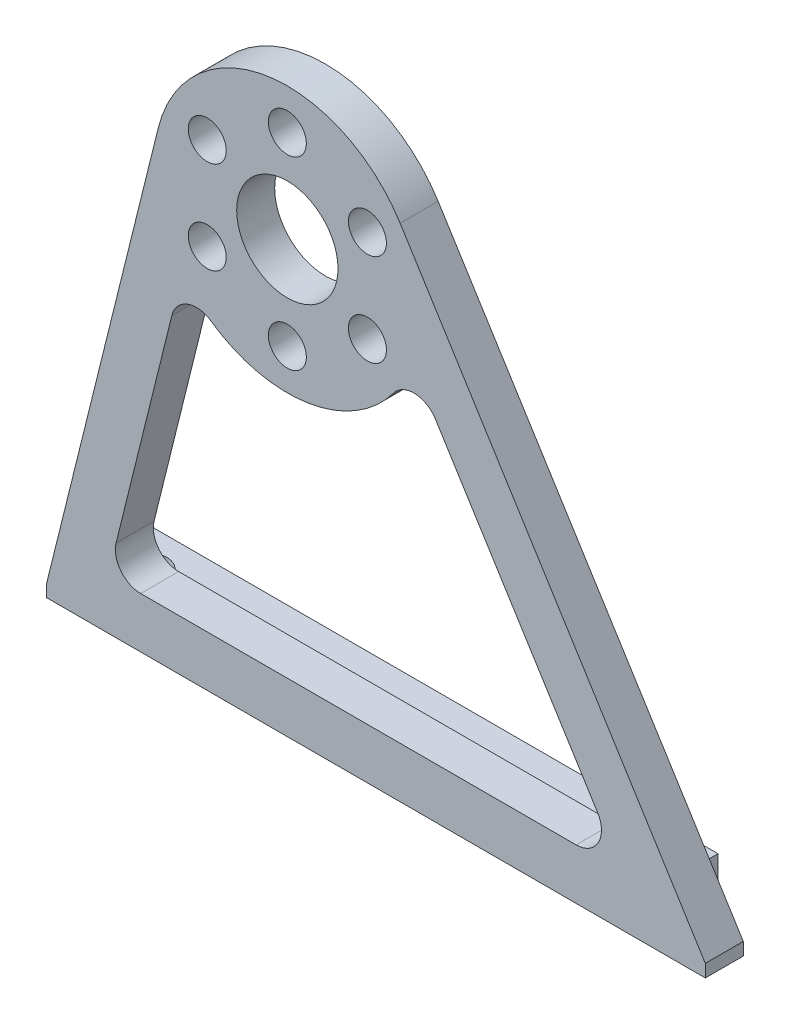
ISO-10303-21;
HEADER;
FILE_DESCRIPTION(('STEP AP214'),'2;1');
FILE_NAME('part.step','',(''),(''),'','','');
FILE_SCHEMA(('AUTOMOTIVE_DESIGN { 1 0 10303 214 1 1 1 1 }'));
ENDSEC;
DATA;
#1=APPLICATION_CONTEXT('core data for automotive mechanical design processes');
#2=APPLICATION_PROTOCOL_DEFINITION('international standard','automotive_design',2000,#1);
#3=PRODUCT_CONTEXT('',#1,'mechanical');
#4=PRODUCT('Part','Part','',(#3));
#5=PRODUCT_RELATED_PRODUCT_CATEGORY('part','',(#4));
#6=PRODUCT_DEFINITION_FORMATION('','',#4);
#7=PRODUCT_DEFINITION_CONTEXT('part definition',#1,'design');
#8=PRODUCT_DEFINITION('design','',#6,#7);
#9=PRODUCT_DEFINITION_SHAPE('','',#8);
#10=(LENGTH_UNIT() NAMED_UNIT(*) SI_UNIT(.MILLI.,.METRE.));
#11=(NAMED_UNIT(*) PLANE_ANGLE_UNIT() SI_UNIT($,.RADIAN.));
#12=(NAMED_UNIT(*) SI_UNIT($,.STERADIAN.) SOLID_ANGLE_UNIT());
#13=UNCERTAINTY_MEASURE_WITH_UNIT(LENGTH_MEASURE(1.E-05),#10,'distance_accuracy_value','');
#14=(GEOMETRIC_REPRESENTATION_CONTEXT(3) GLOBAL_UNCERTAINTY_ASSIGNED_CONTEXT((#13)) GLOBAL_UNIT_ASSIGNED_CONTEXT((#10,
#11,#12)) REPRESENTATION_CONTEXT('',''));
#15=CARTESIAN_POINT('',(0.,0.,0.));
#16=DIRECTION('',(0.,0.,1.));
#17=DIRECTION('',(1.,0.,0.));
#18=AXIS2_PLACEMENT_3D('',#15,#16,#17);
#19=CARTESIAN_POINT('',(0.,0.,6.));
#20=DIRECTION('',(0.,0.,-1.));
#21=DIRECTION('',(-1.,0.,0.));
#22=AXIS2_PLACEMENT_3D('',#19,#20,#21);
#23=CYLINDRICAL_SURFACE('',#22,10.5);
#24=CARTESIAN_POINT('',(0.,0.,3.));
#25=DIRECTION('',(0.,0.,-1.));
#26=DIRECTION('',(-1.,0.,0.));
#27=AXIS2_PLACEMENT_3D('',#24,#25,#26);
#28=CIRCLE('',#27,10.5);
#29=CARTESIAN_POINT('',(-10.1914133471424,2.52687435138502,3.));
#30=VERTEX_POINT('',#29);
#31=CARTESIAN_POINT('',(8.90471895944788,5.56380986853878,3.));
#32=VERTEX_POINT('',#31);
#33=EDGE_CURVE('E48',#30,#32,#28,.T.);
#34=ORIENTED_EDGE('',*,*,#33,.F.);
#35=DIRECTION('',(0.,0.,-1.));
#36=VECTOR('',#35,1.);
#37=CARTESIAN_POINT('',(-10.1914133471424,2.52687435138502,6.));
#38=LINE('',#37,#36);
#39=CARTESIAN_POINT('',(-10.1914133471424,2.52687435138502,6.));
#40=VERTEX_POINT('',#39);
#41=EDGE_CURVE('E316',#40,#30,#38,.T.);
#42=ORIENTED_EDGE('',*,*,#41,.F.);
#43=CARTESIAN_POINT('',(0.,0.,6.));
#44=DIRECTION('',(0.,0.,1.));
#45=DIRECTION('',(1.,0.,0.));
#46=AXIS2_PLACEMENT_3D('',#43,#44,#45);
#47=CIRCLE('',#46,10.5);
#48=CARTESIAN_POINT('',(8.90471895944788,5.56380986853878,6.));
#49=VERTEX_POINT('',#48);
#50=EDGE_CURVE('E282',#49,#40,#47,.T.);
#51=ORIENTED_EDGE('',*,*,#50,.F.);
#52=DIRECTION('',(0.,0.,-1.));
#53=VECTOR('',#52,1.);
#54=CARTESIAN_POINT('',(8.90471895944788,5.56380986853878,6.));
#55=LINE('',#54,#53);
#56=EDGE_CURVE('E296',#49,#32,#55,.T.);
#57=ORIENTED_EDGE('',*,*,#56,.T.);
#58=EDGE_LOOP('',(#34,#42,#51,#57));
#59=FACE_BOUND('',#58,.T.);
#60=ADVANCED_FACE('F34',(#59),#23,.T.);
#61=CARTESIAN_POINT('',(33.,-34.,6.));
#62=DIRECTION('',(-1.,0.,0.));
#63=DIRECTION('',(0.,0.,1.));
#64=AXIS2_PLACEMENT_3D('',#61,#62,#63);
#65=PLANE('',#64);
#66=DIRECTION('',(0.,-1.,0.));
#67=VECTOR('',#66,1.);
#68=CARTESIAN_POINT('',(33.,-34.,3.));
#69=LINE('',#68,#67);
#70=CARTESIAN_POINT('',(33.,-33.,3.));
#71=VERTEX_POINT('',#70);
#72=CARTESIAN_POINT('',(33.,-34.,3.));
#73=VERTEX_POINT('',#72);
#74=EDGE_CURVE('E331',#71,#73,#69,.T.);
#75=ORIENTED_EDGE('',*,*,#74,.F.);
#76=DIRECTION('',(0.,0.,-1.));
#77=VECTOR('',#76,1.);
#78=CARTESIAN_POINT('',(33.,-33.,6.));
#79=LINE('',#78,#77);
#80=CARTESIAN_POINT('',(33.,-33.,6.));
#81=VERTEX_POINT('',#80);
#82=EDGE_CURVE('E304',#81,#71,#79,.T.);
#83=ORIENTED_EDGE('',*,*,#82,.F.);
#84=DIRECTION('',(0.,1.,0.));
#85=VECTOR('',#84,1.);
#86=CARTESIAN_POINT('',(33.,-34.,6.));
#87=LINE('',#86,#85);
#88=CARTESIAN_POINT('',(33.,-34.,6.));
#89=VERTEX_POINT('',#88);
#90=EDGE_CURVE('E292',#89,#81,#87,.T.);
#91=ORIENTED_EDGE('',*,*,#90,.F.);
#92=DIRECTION('',(0.,0.,-1.));
#93=VECTOR('',#92,1.);
#94=CARTESIAN_POINT('',(33.,-34.,6.));
#95=LINE('',#94,#93);
#96=EDGE_CURVE('E307',#89,#73,#95,.T.);
#97=ORIENTED_EDGE('',*,*,#96,.T.);
#98=EDGE_LOOP('',(#75,#83,#91,#97));
#99=FACE_BOUND('',#98,.T.);
#100=ADVANCED_FACE('F406',(#99),#65,.F.);
#101=CARTESIAN_POINT('',(33.,-33.,6.));
#102=DIRECTION('',(-0.848068472328369,-0.529886654146551,0.));
#103=DIRECTION('',(0.529886654146551,-0.848068472328369,0.));
#104=AXIS2_PLACEMENT_3D('',#101,#102,#103);
#105=PLANE('',#104);
#106=DIRECTION('',(0.529886654146551,-0.848068472328369,0.));
#107=VECTOR('',#106,1.);
#108=CARTESIAN_POINT('',(33.,-33.,3.));
#109=LINE('',#108,#107);
#110=EDGE_CURVE('E333',#32,#71,#109,.T.);
#111=ORIENTED_EDGE('',*,*,#110,.F.);
#112=ORIENTED_EDGE('',*,*,#56,.F.);
#113=DIRECTION('',(-0.529886654146551,0.848068472328369,0.));
#114=VECTOR('',#113,1.);
#115=CARTESIAN_POINT('',(33.,-33.,6.));
#116=LINE('',#115,#114);
#117=EDGE_CURVE('E294',#81,#49,#116,.T.);
#118=ORIENTED_EDGE('',*,*,#117,.F.);
#119=ORIENTED_EDGE('',*,*,#82,.T.);
#120=EDGE_LOOP('',(#111,#112,#118,#119));
#121=FACE_BOUND('',#120,.T.);
#122=ADVANCED_FACE('F403',(#121),#105,.F.);
#123=CARTESIAN_POINT('',(0.,0.,6.));
#124=DIRECTION('',(0.,0.,-1.));
#125=DIRECTION('',(-1.,0.,0.));
#126=AXIS2_PLACEMENT_3D('',#123,#124,#125);
#127=CYLINDRICAL_SURFACE('',#126,10.5);
#128=DIRECTION('',(0.,0.,-1.));
#129=VECTOR('',#128,1.);
#130=CARTESIAN_POINT('',(-6.02636205093039,-8.59842778832887,6.));
#131=LINE('',#130,#129);
#132=CARTESIAN_POINT('',(-6.02636205093039,-8.59842778832887,6.));
#133=VERTEX_POINT('',#132);
#134=CARTESIAN_POINT('',(-6.02636205093039,-8.59842778832887,3.));
#135=VERTEX_POINT('',#134);
#136=EDGE_CURVE('E278',#133,#135,#131,.T.);
#137=ORIENTED_EDGE('',*,*,#136,.T.);
#138=CARTESIAN_POINT('',(0.,0.,3.));
#139=DIRECTION('',(0.,0.,-1.));
#140=DIRECTION('',(-1.,0.,0.));
#141=AXIS2_PLACEMENT_3D('',#138,#139,#140);
#142=CIRCLE('',#141,10.5);
#143=CARTESIAN_POINT('',(8.39646805668367,-6.30470650967124,3.));
#144=VERTEX_POINT('',#143);
#145=EDGE_CURVE('E335',#135,#144,#142,.F.);
#146=ORIENTED_EDGE('',*,*,#145,.T.);
#147=DIRECTION('',(0.,0.,-1.));
#148=VECTOR('',#147,1.);
#149=CARTESIAN_POINT('',(8.39646805668367,-6.30470650967124,6.));
#150=LINE('',#149,#148);
#151=CARTESIAN_POINT('',(8.39646805668367,-6.30470650967124,6.));
#152=VERTEX_POINT('',#151);
#153=EDGE_CURVE('E257',#152,#144,#150,.T.);
#154=ORIENTED_EDGE('',*,*,#153,.F.);
#155=CARTESIAN_POINT('',(0.,0.,6.));
#156=DIRECTION('',(0.,0.,-1.));
#157=DIRECTION('',(1.,0.,0.));
#158=AXIS2_PLACEMENT_3D('',#155,#156,#157);
#159=CIRCLE('',#158,10.5);
#160=EDGE_CURVE('E240',#152,#133,#159,.T.);
#161=ORIENTED_EDGE('',*,*,#160,.T.);
#162=EDGE_LOOP('',(#137,#146,#154,#161));
#163=FACE_BOUND('',#162,.T.);
#164=ADVANCED_FACE('F413',(#163),#127,.T.);
#165=CARTESIAN_POINT('',(-7.17424053682189,-10.2362235575344,6.));
#166=DIRECTION('',(0.,0.,-1.));
#167=DIRECTION('',(-1.,0.,0.));
#168=AXIS2_PLACEMENT_3D('',#165,#166,#167);
#169=CYLINDRICAL_SURFACE('',#168,2.);
#170=DIRECTION('',(0.,0.,-1.));
#171=VECTOR('',#170,1.);
#172=CARTESIAN_POINT('',(-9.11546212675378,-9.75491415727056,6.));
#173=LINE('',#172,#171);
#174=CARTESIAN_POINT('',(-9.11546212675378,-9.75491415727056,6.));
#175=VERTEX_POINT('',#174);
#176=CARTESIAN_POINT('',(-9.11546212675378,-9.75491415727056,3.));
#177=VERTEX_POINT('',#176);
#178=EDGE_CURVE('E275',#175,#177,#173,.T.);
#179=ORIENTED_EDGE('',*,*,#178,.T.);
#180=CARTESIAN_POINT('',(-7.17424053682189,-10.2362235575344,3.));
#181=DIRECTION('',(0.,0.,-1.));
#182=DIRECTION('',(-1.,0.,0.));
#183=AXIS2_PLACEMENT_3D('',#180,#181,#182);
#184=CIRCLE('',#183,2.);
#185=EDGE_CURVE('E338',#177,#135,#184,.T.);
#186=ORIENTED_EDGE('',*,*,#185,.T.);
#187=ORIENTED_EDGE('',*,*,#136,.F.);
#188=CARTESIAN_POINT('',(-7.17424053682189,-10.2362235575344,6.));
#189=DIRECTION('',(0.,0.,1.));
#190=DIRECTION('',(1.,0.,0.));
#191=AXIS2_PLACEMENT_3D('',#188,#189,#190);
#192=CIRCLE('',#191,2.);
#193=EDGE_CURVE('E242',#133,#175,#192,.T.);
#194=ORIENTED_EDGE('',*,*,#193,.T.);
#195=EDGE_LOOP('',(#179,#186,#187,#194));
#196=FACE_BOUND('',#195,.T.);
#197=ADVANCED_FACE('F433',(#196),#169,.F.);
#198=CARTESIAN_POINT('',(-9.11546212675378,-9.75491415727056,6.));
#199=DIRECTION('',(0.970610794965944,-0.240654700131907,0.));
#200=DIRECTION('',(0.240654700131907,0.970610794965944,0.));
#201=AXIS2_PLACEMENT_3D('',#198,#199,#200);
#202=PLANE('',#201);
#203=DIRECTION('',(0.,0.,-1.));
#204=VECTOR('',#203,1.);
#205=CARTESIAN_POINT('',(-13.5198395714965,-27.5186905997362,6.));
#206=LINE('',#205,#204);
#207=CARTESIAN_POINT('',(-13.5198395714965,-27.5186905997362,6.));
#208=VERTEX_POINT('',#207);
#209=CARTESIAN_POINT('',(-13.5198395714965,-27.5186905997362,3.));
#210=VERTEX_POINT('',#209);
#211=EDGE_CURVE('E272',#208,#210,#206,.T.);
#212=ORIENTED_EDGE('',*,*,#211,.T.);
#213=DIRECTION('',(0.240654700131907,0.970610794965944,0.));
#214=VECTOR('',#213,1.);
#215=CARTESIAN_POINT('',(-9.11546212675378,-9.75491415727056,3.));
#216=LINE('',#215,#214);
#217=EDGE_CURVE('E341',#210,#177,#216,.T.);
#218=ORIENTED_EDGE('',*,*,#217,.T.);
#219=ORIENTED_EDGE('',*,*,#178,.F.);
#220=DIRECTION('',(-0.240654700131907,-0.970610794965944,0.));
#221=VECTOR('',#220,1.);
#222=CARTESIAN_POINT('',(-9.11546212675378,-9.75491415727056,6.));
#223=LINE('',#222,#221);
#224=EDGE_CURVE('E244',#175,#208,#223,.T.);
#225=ORIENTED_EDGE('',*,*,#224,.T.);
#226=EDGE_LOOP('',(#212,#218,#219,#225));
#227=FACE_BOUND('',#226,.T.);
#228=ADVANCED_FACE('F437',(#227),#202,.T.);
#229=CARTESIAN_POINT('',(-11.5786179815646,-28.,6.));
#230=DIRECTION('',(0.,0.,-1.));
#231=DIRECTION('',(-1.,0.,0.));
#232=AXIS2_PLACEMENT_3D('',#229,#230,#231);
#233=CYLINDRICAL_SURFACE('',#232,2.);
#234=DIRECTION('',(0.,0.,-1.));
#235=VECTOR('',#234,1.);
#236=CARTESIAN_POINT('',(-11.5786179815646,-30.,6.));
#237=LINE('',#236,#235);
#238=CARTESIAN_POINT('',(-11.5786179815646,-30.,6.));
#239=VERTEX_POINT('',#238);
#240=CARTESIAN_POINT('',(-11.5786179815646,-30.,3.));
#241=VERTEX_POINT('',#240);
#242=EDGE_CURVE('E269',#239,#241,#237,.T.);
#243=ORIENTED_EDGE('',*,*,#242,.T.);
#244=CARTESIAN_POINT('',(-11.5786179815646,-28.,3.));
#245=DIRECTION('',(0.,0.,-1.));
#246=DIRECTION('',(-1.,0.,0.));
#247=AXIS2_PLACEMENT_3D('',#244,#245,#246);
#248=CIRCLE('',#247,2.);
#249=EDGE_CURVE('E344',#241,#210,#248,.T.);
#250=ORIENTED_EDGE('',*,*,#249,.T.);
#251=ORIENTED_EDGE('',*,*,#211,.F.);
#252=CARTESIAN_POINT('',(-11.5786179815646,-28.,6.));
#253=DIRECTION('',(0.,0.,1.));
#254=DIRECTION('',(-1.,0.,0.));
#255=AXIS2_PLACEMENT_3D('',#252,#253,#254);
#256=CIRCLE('',#255,2.);
#257=EDGE_CURVE('E246',#208,#239,#256,.T.);
#258=ORIENTED_EDGE('',*,*,#257,.T.);
#259=EDGE_LOOP('',(#243,#250,#251,#258));
#260=FACE_BOUND('',#259,.T.);
#261=ADVANCED_FACE('F441',(#260),#233,.F.);
#262=CARTESIAN_POINT('',(-11.5786179815646,-30.,6.));
#263=DIRECTION('',(0.,1.,0.));
#264=DIRECTION('',(0.,0.,1.));
#265=AXIS2_PLACEMENT_3D('',#262,#263,#264);
#266=PLANE('',#265);
#267=DIRECTION('',(0.,0.,-1.));
#268=VECTOR('',#267,1.);
#269=CARTESIAN_POINT('',(22.8010201381667,-30.,6.));
#270=LINE('',#269,#268);
#271=CARTESIAN_POINT('',(22.8010201381667,-30.,6.));
#272=VERTEX_POINT('',#271);
#273=CARTESIAN_POINT('',(22.8010201381667,-30.,3.));
#274=VERTEX_POINT('',#273);
#275=EDGE_CURVE('E266',#272,#274,#270,.T.);
#276=ORIENTED_EDGE('',*,*,#275,.T.);
#277=DIRECTION('',(-1.,0.,0.));
#278=VECTOR('',#277,1.);
#279=CARTESIAN_POINT('',(-11.5786179815646,-30.,3.));
#280=LINE('',#279,#278);
#281=EDGE_CURVE('E347',#274,#241,#280,.T.);
#282=ORIENTED_EDGE('',*,*,#281,.T.);
#283=ORIENTED_EDGE('',*,*,#242,.F.);
#284=DIRECTION('',(1.,0.,0.));
#285=VECTOR('',#284,1.);
#286=CARTESIAN_POINT('',(-11.5786179815646,-30.,6.));
#287=LINE('',#286,#285);
#288=EDGE_CURVE('E248',#239,#272,#287,.T.);
#289=ORIENTED_EDGE('',*,*,#288,.T.);
#290=EDGE_LOOP('',(#276,#282,#283,#289));
#291=FACE_BOUND('',#290,.T.);
#292=ADVANCED_FACE('F445',(#291),#266,.T.);
#293=CARTESIAN_POINT('',(22.8010201381667,-28.,6.));
#294=DIRECTION('',(0.,0.,-1.));
#295=DIRECTION('',(-1.,0.,0.));
#296=AXIS2_PLACEMENT_3D('',#293,#294,#295);
#297=CYLINDRICAL_SURFACE('',#296,2.);
#298=DIRECTION('',(0.,0.,-1.));
#299=VECTOR('',#298,1.);
#300=CARTESIAN_POINT('',(24.4971570828234,-26.9402266917069,6.));
#301=LINE('',#300,#299);
#302=CARTESIAN_POINT('',(24.4971570828234,-26.9402266917069,6.));
#303=VERTEX_POINT('',#302);
#304=CARTESIAN_POINT('',(24.4971570828234,-26.9402266917069,3.));
#305=VERTEX_POINT('',#304);
#306=EDGE_CURVE('E263',#303,#305,#301,.T.);
#307=ORIENTED_EDGE('',*,*,#306,.T.);
#308=CARTESIAN_POINT('',(22.8010201381667,-28.,3.));
#309=DIRECTION('',(0.,0.,-1.));
#310=DIRECTION('',(-1.,0.,0.));
#311=AXIS2_PLACEMENT_3D('',#308,#309,#310);
#312=CIRCLE('',#311,2.);
#313=EDGE_CURVE('E350',#305,#274,#312,.T.);
#314=ORIENTED_EDGE('',*,*,#313,.T.);
#315=ORIENTED_EDGE('',*,*,#275,.F.);
#316=CARTESIAN_POINT('',(22.8010201381667,-28.,6.));
#317=DIRECTION('',(0.,0.,1.));
#318=DIRECTION('',(1.,0.,0.));
#319=AXIS2_PLACEMENT_3D('',#316,#317,#318);
#320=CIRCLE('',#319,2.);
#321=EDGE_CURVE('E250',#272,#303,#320,.T.);
#322=ORIENTED_EDGE('',*,*,#321,.T.);
#323=EDGE_LOOP('',(#307,#314,#315,#322));
#324=FACE_BOUND('',#323,.T.);
#325=ADVANCED_FACE('F449',(#324),#297,.F.);
#326=CARTESIAN_POINT('',(24.4971570828234,-26.9402266917069,6.));
#327=DIRECTION('',(-0.848068472328369,-0.529886654146551,0.));
#328=DIRECTION('',(0.529886654146551,-0.848068472328369,0.));
#329=AXIS2_PLACEMENT_3D('',#326,#327,#328);
#330=PLANE('',#329);
#331=DIRECTION('',(0.,0.,-1.));
#332=VECTOR('',#331,1.);
#333=CARTESIAN_POINT('',(11.6919322502325,-6.44582967941076,6.));
#334=LINE('',#333,#332);
#335=CARTESIAN_POINT('',(11.6919322502325,-6.44582967941076,6.));
#336=VERTEX_POINT('',#335);
#337=CARTESIAN_POINT('',(11.6919322502325,-6.44582967941076,3.));
#338=VERTEX_POINT('',#337);
#339=EDGE_CURVE('E260',#336,#338,#334,.T.);
#340=ORIENTED_EDGE('',*,*,#339,.T.);
#341=DIRECTION('',(0.529886654146551,-0.848068472328369,0.));
#342=VECTOR('',#341,1.);
#343=CARTESIAN_POINT('',(24.4971570828234,-26.9402266917069,3.));
#344=LINE('',#343,#342);
#345=EDGE_CURVE('E56',#338,#305,#344,.T.);
#346=ORIENTED_EDGE('',*,*,#345,.T.);
#347=ORIENTED_EDGE('',*,*,#306,.F.);
#348=DIRECTION('',(-0.529886654146551,0.848068472328369,0.));
#349=VECTOR('',#348,1.);
#350=CARTESIAN_POINT('',(24.4971570828234,-26.9402266917069,6.));
#351=LINE('',#350,#349);
#352=EDGE_CURVE('E252',#303,#336,#351,.T.);
#353=ORIENTED_EDGE('',*,*,#352,.T.);
#354=EDGE_LOOP('',(#340,#346,#347,#353));
#355=FACE_BOUND('',#354,.T.);
#356=ADVANCED_FACE('F453',(#355),#330,.T.);
#357=CARTESIAN_POINT('',(9.99579530557579,-7.50560298770386,6.));
#358=DIRECTION('',(0.,0.,-1.));
#359=DIRECTION('',(-1.,0.,0.));
#360=AXIS2_PLACEMENT_3D('',#357,#358,#359);
#361=CYLINDRICAL_SURFACE('',#360,2.);
#362=ORIENTED_EDGE('',*,*,#153,.T.);
#363=CARTESIAN_POINT('',(9.99579530557579,-7.50560298770386,3.));
#364=DIRECTION('',(0.,0.,-1.));
#365=DIRECTION('',(-1.,0.,0.));
#366=AXIS2_PLACEMENT_3D('',#363,#364,#365);
#367=CIRCLE('',#366,2.);
#368=EDGE_CURVE('E354',#144,#338,#367,.T.);
#369=ORIENTED_EDGE('',*,*,#368,.T.);
#370=ORIENTED_EDGE('',*,*,#339,.F.);
#371=CARTESIAN_POINT('',(9.99579530557579,-7.50560298770386,6.));
#372=DIRECTION('',(0.,0.,1.));
#373=DIRECTION('',(-1.,0.,0.));
#374=AXIS2_PLACEMENT_3D('',#371,#372,#373);
#375=CIRCLE('',#374,2.);
#376=EDGE_CURVE('E255',#336,#152,#375,.T.);
#377=ORIENTED_EDGE('',*,*,#376,.T.);
#378=EDGE_LOOP('',(#362,#369,#370,#377));
#379=FACE_BOUND('',#378,.T.);
#380=ADVANCED_FACE('F457',(#379),#361,.F.);
#381=CARTESIAN_POINT('',(0.,0.,6.));
#382=DIRECTION('',(0.,0.,-1.));
#383=DIRECTION('',(-1.,0.,0.));
#384=AXIS2_PLACEMENT_3D('',#381,#382,#383);
#385=CYLINDRICAL_SURFACE('',#384,4.);
#386=CARTESIAN_POINT('',(0.,0.,6.));
#387=DIRECTION('',(0.,0.,1.));
#388=DIRECTION('',(1.,0.,0.));
#389=AXIS2_PLACEMENT_3D('',#386,#387,#388);
#390=CIRCLE('',#389,4.);
#391=CARTESIAN_POINT('',(4.,0.,6.));
#392=VERTEX_POINT('',#391);
#393=EDGE_CURVE('E237',#392,#392,#390,.T.);
#394=ORIENTED_EDGE('',*,*,#393,.T.);
#395=EDGE_LOOP('',(#394));
#396=FACE_BOUND('',#395,.T.);
#397=CARTESIAN_POINT('',(0.,0.,3.));
#398=DIRECTION('',(0.,0.,-1.));
#399=DIRECTION('',(-1.,0.,0.));
#400=AXIS2_PLACEMENT_3D('',#397,#398,#399);
#401=CIRCLE('',#400,4.);
#402=CARTESIAN_POINT('',(-4.,0.,3.));
#403=VERTEX_POINT('',#402);
#404=EDGE_CURVE('E356',#403,#403,#401,.T.);
#405=ORIENTED_EDGE('',*,*,#404,.T.);
#406=EDGE_LOOP('',(#405));
#407=FACE_BOUND('',#406,.T.);
#408=ADVANCED_FACE('F461',(#396,#407),#385,.F.);
#409=CARTESIAN_POINT('',(0.,7.3,6.));
#410=DIRECTION('',(0.,0.,-1.));
#411=DIRECTION('',(-1.,0.,0.));
#412=AXIS2_PLACEMENT_3D('',#409,#410,#411);
#413=CYLINDRICAL_SURFACE('',#412,1.5);
#414=CARTESIAN_POINT('',(0.,7.3,6.));
#415=DIRECTION('',(0.,0.,1.));
#416=DIRECTION('',(1.,0.,0.));
#417=AXIS2_PLACEMENT_3D('',#414,#415,#416);
#418=CIRCLE('',#417,1.5);
#419=CARTESIAN_POINT('',(1.5,7.3,6.));
#420=VERTEX_POINT('',#419);
#421=EDGE_CURVE('E234',#420,#420,#418,.T.);
#422=ORIENTED_EDGE('',*,*,#421,.T.);
#423=EDGE_LOOP('',(#422));
#424=FACE_BOUND('',#423,.T.);
#425=CARTESIAN_POINT('',(0.,7.3,3.));
#426=DIRECTION('',(0.,0.,-1.));
#427=DIRECTION('',(-1.,0.,0.));
#428=AXIS2_PLACEMENT_3D('',#425,#426,#427);
#429=CIRCLE('',#428,1.5);
#430=CARTESIAN_POINT('',(-1.5,7.3,3.));
#431=VERTEX_POINT('',#430);
#432=EDGE_CURVE('E359',#431,#431,#429,.T.);
#433=ORIENTED_EDGE('',*,*,#432,.T.);
#434=EDGE_LOOP('',(#433));
#435=FACE_BOUND('',#434,.T.);
#436=ADVANCED_FACE('F465',(#424,#435),#413,.F.);
#437=CARTESIAN_POINT('',(6.32198544762641,3.64999999999999,6.));
#438=DIRECTION('',(0.,0.,-1.));
#439=DIRECTION('',(-1.,0.,0.));
#440=AXIS2_PLACEMENT_3D('',#437,#438,#439);
#441=CYLINDRICAL_SURFACE('',#440,1.5);
#442=CARTESIAN_POINT('',(6.32198544762641,3.64999999999999,6.));
#443=DIRECTION('',(0.,0.,1.));
#444=DIRECTION('',(1.,0.,0.));
#445=AXIS2_PLACEMENT_3D('',#442,#443,#444);
#446=CIRCLE('',#445,1.5);
#447=CARTESIAN_POINT('',(7.82198544762641,3.64999999999999,6.));
#448=VERTEX_POINT('',#447);
#449=EDGE_CURVE('E231',#448,#448,#446,.T.);
#450=ORIENTED_EDGE('',*,*,#449,.T.);
#451=EDGE_LOOP('',(#450));
#452=FACE_BOUND('',#451,.T.);
#453=CARTESIAN_POINT('',(6.32198544762641,3.64999999999999,3.));
#454=DIRECTION('',(0.,0.,-1.));
#455=DIRECTION('',(-1.,0.,0.));
#456=AXIS2_PLACEMENT_3D('',#453,#454,#455);
#457=CIRCLE('',#456,1.5);
#458=CARTESIAN_POINT('',(4.82198544762641,3.64999999999999,3.));
#459=VERTEX_POINT('',#458);
#460=EDGE_CURVE('E362',#459,#459,#457,.T.);
#461=ORIENTED_EDGE('',*,*,#460,.T.);
#462=EDGE_LOOP('',(#461));
#463=FACE_BOUND('',#462,.T.);
#464=ADVANCED_FACE('F469',(#452,#463),#441,.F.);
#465=CARTESIAN_POINT('',(6.32198544762639,-3.65000000000003,6.));
#466=DIRECTION('',(0.,0.,-1.));
#467=DIRECTION('',(-1.,0.,0.));
#468=AXIS2_PLACEMENT_3D('',#465,#466,#467);
#469=CYLINDRICAL_SURFACE('',#468,1.5);
#470=CARTESIAN_POINT('',(6.32198544762639,-3.65000000000003,6.));
#471=DIRECTION('',(0.,0.,1.));
#472=DIRECTION('',(1.,0.,0.));
#473=AXIS2_PLACEMENT_3D('',#470,#471,#472);
#474=CIRCLE('',#473,1.5);
#475=CARTESIAN_POINT('',(7.82198544762639,-3.65000000000003,6.));
#476=VERTEX_POINT('',#475);
#477=EDGE_CURVE('E228',#476,#476,#474,.T.);
#478=ORIENTED_EDGE('',*,*,#477,.T.);
#479=EDGE_LOOP('',(#478));
#480=FACE_BOUND('',#479,.T.);
#481=CARTESIAN_POINT('',(6.32198544762639,-3.65000000000003,3.));
#482=DIRECTION('',(0.,0.,-1.));
#483=DIRECTION('',(-1.,0.,0.));
#484=AXIS2_PLACEMENT_3D('',#481,#482,#483);
#485=CIRCLE('',#484,1.5);
#486=CARTESIAN_POINT('',(4.82198544762639,-3.65000000000003,3.));
#487=VERTEX_POINT('',#486);
#488=EDGE_CURVE('E365',#487,#487,#485,.T.);
#489=ORIENTED_EDGE('',*,*,#488,.T.);
#490=EDGE_LOOP('',(#489));
#491=FACE_BOUND('',#490,.T.);
#492=ADVANCED_FACE('F473',(#480,#491),#469,.F.);
#493=CARTESIAN_POINT('',(6.20647540774354E-13,-7.3,6.));
#494=DIRECTION('',(0.,0.,-1.));
#495=DIRECTION('',(-1.,0.,0.));
#496=AXIS2_PLACEMENT_3D('',#493,#494,#495);
#497=CYLINDRICAL_SURFACE('',#496,1.50000000000064);
#498=CARTESIAN_POINT('',(6.20647540774354E-13,-7.3,6.));
#499=DIRECTION('',(0.,0.,1.));
#500=DIRECTION('',(1.,0.,0.));
#501=AXIS2_PLACEMENT_3D('',#498,#499,#500);
#502=CIRCLE('',#501,1.50000000000064);
#503=CARTESIAN_POINT('',(1.50000000000126,-7.3,6.));
#504=VERTEX_POINT('',#503);
#505=EDGE_CURVE('E225',#504,#504,#502,.T.);
#506=ORIENTED_EDGE('',*,*,#505,.T.);
#507=EDGE_LOOP('',(#506));
#508=FACE_BOUND('',#507,.T.);
#509=CARTESIAN_POINT('',(6.20647540774354E-13,-7.3,3.));
#510=DIRECTION('',(0.,0.,-1.));
#511=DIRECTION('',(-1.,0.,0.));
#512=AXIS2_PLACEMENT_3D('',#509,#510,#511);
#513=CIRCLE('',#512,1.50000000000064);
#514=CARTESIAN_POINT('',(-1.50000000000002,-7.3,3.));
#515=VERTEX_POINT('',#514);
#516=EDGE_CURVE('E368',#515,#515,#513,.T.);
#517=ORIENTED_EDGE('',*,*,#516,.T.);
#518=EDGE_LOOP('',(#517));
#519=FACE_BOUND('',#518,.T.);
#520=ADVANCED_FACE('F477',(#508,#519),#497,.F.);
#521=CARTESIAN_POINT('',(-6.32198544762594,-3.65000000000027,6.));
#522=DIRECTION('',(0.,0.,-1.));
#523=DIRECTION('',(-1.,0.,0.));
#524=AXIS2_PLACEMENT_3D('',#521,#522,#523);
#525=CYLINDRICAL_SURFACE('',#524,1.50000000000059);
#526=CARTESIAN_POINT('',(-6.32198544762594,-3.65000000000027,6.));
#527=DIRECTION('',(0.,0.,1.));
#528=DIRECTION('',(1.,0.,0.));
#529=AXIS2_PLACEMENT_3D('',#526,#527,#528);
#530=CIRCLE('',#529,1.50000000000059);
#531=CARTESIAN_POINT('',(-4.82198544762534,-3.65000000000027,6.));
#532=VERTEX_POINT('',#531);
#533=EDGE_CURVE('E214',#532,#532,#530,.T.);
#534=ORIENTED_EDGE('',*,*,#533,.T.);
#535=EDGE_LOOP('',(#534));
#536=FACE_BOUND('',#535,.T.);
#537=CARTESIAN_POINT('',(-6.32198544762594,-3.65000000000027,3.));
#538=DIRECTION('',(0.,0.,-1.));
#539=DIRECTION('',(-1.,0.,0.));
#540=AXIS2_PLACEMENT_3D('',#537,#538,#539);
#541=CIRCLE('',#540,1.50000000000059);
#542=CARTESIAN_POINT('',(-7.82198544762653,-3.65000000000027,3.));
#543=VERTEX_POINT('',#542);
#544=EDGE_CURVE('E371',#543,#543,#541,.T.);
#545=ORIENTED_EDGE('',*,*,#544,.T.);
#546=EDGE_LOOP('',(#545));
#547=FACE_BOUND('',#546,.T.);
#548=ADVANCED_FACE('F481',(#536,#547),#525,.F.);
#549=CARTESIAN_POINT('',(-6.32198544762636,3.65000000000007,6.));
#550=DIRECTION('',(0.,0.,-1.));
#551=DIRECTION('',(-1.,0.,0.));
#552=AXIS2_PLACEMENT_3D('',#549,#550,#551);
#553=CYLINDRICAL_SURFACE('',#552,1.5);
#554=CARTESIAN_POINT('',(-6.32198544762636,3.65000000000007,6.));
#555=DIRECTION('',(0.,0.,1.));
#556=DIRECTION('',(1.,0.,0.));
#557=AXIS2_PLACEMENT_3D('',#554,#555,#556);
#558=CIRCLE('',#557,1.5);
#559=CARTESIAN_POINT('',(-4.82198544762636,3.65000000000007,6.));
#560=VERTEX_POINT('',#559);
#561=EDGE_CURVE('E210',#560,#560,#558,.T.);
#562=ORIENTED_EDGE('',*,*,#561,.T.);
#563=EDGE_LOOP('',(#562));
#564=FACE_BOUND('',#563,.T.);
#565=CARTESIAN_POINT('',(-6.32198544762636,3.65000000000007,3.));
#566=DIRECTION('',(0.,0.,-1.));
#567=DIRECTION('',(-1.,0.,0.));
#568=AXIS2_PLACEMENT_3D('',#565,#566,#567);
#569=CIRCLE('',#568,1.5);
#570=CARTESIAN_POINT('',(-7.82198544762636,3.65000000000007,3.));
#571=VERTEX_POINT('',#570);
#572=EDGE_CURVE('E182',#571,#571,#569,.T.);
#573=ORIENTED_EDGE('',*,*,#572,.T.);
#574=EDGE_LOOP('',(#573));
#575=FACE_BOUND('',#574,.T.);
#576=ADVANCED_FACE('F485',(#564,#575),#553,.F.);
#577=CARTESIAN_POINT('',(-14.,-31.,2.99999999999999));
#578=DIRECTION('',(0.,-1.,0.));
#579=DIRECTION('',(0.,0.,-1.));
#580=AXIS2_PLACEMENT_3D('',#577,#578,#579);
#581=PLANE('',#580);
#582=CARTESIAN_POINT('',(-14.,-31.,2.99999999999999));
#583=DIRECTION('',(0.,-1.,0.));
#584=DIRECTION('',(0.,0.,-1.));
#585=AXIS2_PLACEMENT_3D('',#582,#583,#584);
#586=CIRCLE('',#585,1.5);
#587=CARTESIAN_POINT('',(-12.5,-31.,3.));
#588=VERTEX_POINT('',#587);
#589=CARTESIAN_POINT('',(-15.5,-31.,3.));
#590=VERTEX_POINT('',#589);
#591=EDGE_CURVE('E205',#588,#590,#586,.T.);
#592=ORIENTED_EDGE('',*,*,#591,.T.);
#593=DIRECTION('',(-1.,0.,0.));
#594=VECTOR('',#593,1.);
#595=CARTESIAN_POINT('',(-22.8481753674721,-31.,3.));
#596=LINE('',#595,#594);
#597=EDGE_CURVE('E190',#588,#590,#596,.T.);
#598=ORIENTED_EDGE('',*,*,#597,.F.);
#599=EDGE_LOOP('',(#592,#598));
#600=FACE_BOUND('',#599,.T.);
#601=ADVANCED_FACE('F209',(#600),#581,.T.);
#602=CARTESIAN_POINT('',(23.,-31.,3.00000000000001));
#603=DIRECTION('',(0.,-1.,0.));
#604=DIRECTION('',(0.,0.,-1.));
#605=AXIS2_PLACEMENT_3D('',#602,#603,#604);
#606=PLANE('',#605);
#607=CARTESIAN_POINT('',(23.,-31.,3.00000000000001));
#608=DIRECTION('',(0.,-1.,0.));
#609=DIRECTION('',(0.,0.,-1.));
#610=AXIS2_PLACEMENT_3D('',#607,#608,#609);
#611=CIRCLE('',#610,1.5);
#612=CARTESIAN_POINT('',(24.5,-31.,3.));
#613=VERTEX_POINT('',#612);
#614=CARTESIAN_POINT('',(21.5,-31.,3.));
#615=VERTEX_POINT('',#614);
#616=EDGE_CURVE('E217',#613,#615,#611,.T.);
#617=ORIENTED_EDGE('',*,*,#616,.T.);
#618=DIRECTION('',(1.,0.,0.));
#619=VECTOR('',#618,1.);
#620=CARTESIAN_POINT('',(23.,-31.,3.));
#621=LINE('',#620,#619);
#622=EDGE_CURVE('E41',#615,#613,#621,.T.);
#623=ORIENTED_EDGE('',*,*,#622,.T.);
#624=EDGE_LOOP('',(#617,#623));
#625=FACE_BOUND('',#624,.T.);
#626=ADVANCED_FACE('F321',(#625),#606,.T.);
#627=CARTESIAN_POINT('',(0.,0.,6.));
#628=DIRECTION('',(0.,0.,1.));
#629=DIRECTION('',(1.,0.,0.));
#630=AXIS2_PLACEMENT_3D('',#627,#628,#629);
#631=PLANE('',#630);
#632=ORIENTED_EDGE('',*,*,#533,.F.);
#633=EDGE_LOOP('',(#632));
#634=FACE_BOUND('',#633,.T.);
#635=ORIENTED_EDGE('',*,*,#477,.F.);
#636=EDGE_LOOP('',(#635));
#637=FACE_BOUND('',#636,.T.);
#638=ORIENTED_EDGE('',*,*,#421,.F.);
#639=EDGE_LOOP('',(#638));
#640=FACE_BOUND('',#639,.T.);
#641=ORIENTED_EDGE('',*,*,#193,.F.);
#642=ORIENTED_EDGE('',*,*,#160,.F.);
#643=ORIENTED_EDGE('',*,*,#376,.F.);
#644=ORIENTED_EDGE('',*,*,#352,.F.);
#645=ORIENTED_EDGE('',*,*,#321,.F.);
#646=ORIENTED_EDGE('',*,*,#288,.F.);
#647=ORIENTED_EDGE('',*,*,#257,.F.);
#648=ORIENTED_EDGE('',*,*,#224,.F.);
#649=EDGE_LOOP('',(#641,#642,#643,#644,#645,#646,#647,#648));
#650=FACE_BOUND('',#649,.T.);
#651=ORIENTED_EDGE('',*,*,#50,.T.);
#652=DIRECTION('',(-0.240654700131907,-0.970610794965944,0.));
#653=VECTOR('',#652,1.);
#654=CARTESIAN_POINT('',(-10.1914133471424,2.52687435138502,6.));
#655=LINE('',#654,#653);
#656=CARTESIAN_POINT('',(-19.,-33.,6.));
#657=VERTEX_POINT('',#656);
#658=EDGE_CURVE('E285',#40,#657,#655,.T.);
#659=ORIENTED_EDGE('',*,*,#658,.T.);
#660=DIRECTION('',(0.,-1.,0.));
#661=VECTOR('',#660,1.);
#662=CARTESIAN_POINT('',(-19.,-33.,6.));
#663=LINE('',#662,#661);
#664=CARTESIAN_POINT('',(-19.,-34.,6.));
#665=VERTEX_POINT('',#664);
#666=EDGE_CURVE('E288',#657,#665,#663,.T.);
#667=ORIENTED_EDGE('',*,*,#666,.T.);
#668=DIRECTION('',(1.,0.,0.));
#669=VECTOR('',#668,1.);
#670=CARTESIAN_POINT('',(-19.,-34.,6.));
#671=LINE('',#670,#669);
#672=EDGE_CURVE('E290',#665,#89,#671,.T.);
#673=ORIENTED_EDGE('',*,*,#672,.T.);
#674=ORIENTED_EDGE('',*,*,#90,.T.);
#675=ORIENTED_EDGE('',*,*,#117,.T.);
#676=EDGE_LOOP('',(#651,#659,#667,#673,#674,#675));
#677=FACE_BOUND('',#676,.T.);
#678=ORIENTED_EDGE('',*,*,#393,.F.);
#679=EDGE_LOOP('',(#678));
#680=FACE_BOUND('',#679,.T.);
#681=ORIENTED_EDGE('',*,*,#449,.F.);
#682=EDGE_LOOP('',(#681));
#683=FACE_BOUND('',#682,.T.);
#684=ORIENTED_EDGE('',*,*,#505,.F.);
#685=EDGE_LOOP('',(#684));
#686=FACE_BOUND('',#685,.T.);
#687=ORIENTED_EDGE('',*,*,#561,.F.);
#688=EDGE_LOOP('',(#687));
#689=FACE_BOUND('',#688,.T.);
#690=ADVANCED_FACE('F394',(#634,#637,#640,#650,#677,#680,#683,#686,#689),#631,.T.);
#691=CARTESIAN_POINT('',(0.,0.,0.));
#692=DIRECTION('',(0.,0.,1.));
#693=DIRECTION('',(1.,0.,0.));
#694=AXIS2_PLACEMENT_3D('',#691,#692,#693);
#695=PLANE('',#694);
#696=DIRECTION('',(-0.240654700131907,-0.970610794965944,0.));
#697=VECTOR('',#696,1.);
#698=CARTESIAN_POINT('',(-10.1914133471424,2.52687435138502,0.));
#699=LINE('',#698,#697);
#700=CARTESIAN_POINT('',(-18.5041169923515,-31.,0.));
#701=VERTEX_POINT('',#700);
#702=CARTESIAN_POINT('',(-19.,-33.,0.));
#703=VERTEX_POINT('',#702);
#704=EDGE_CURVE('E281',#701,#703,#699,.T.);
#705=ORIENTED_EDGE('',*,*,#704,.F.);
#706=DIRECTION('',(-1.,0.,0.));
#707=VECTOR('',#706,1.);
#708=CARTESIAN_POINT('',(-22.8481753674721,-31.,0.));
#709=LINE('',#708,#707);
#710=CARTESIAN_POINT('',(28.,-31.,0.));
#711=VERTEX_POINT('',#710);
#712=EDGE_CURVE('E173',#711,#701,#709,.T.);
#713=ORIENTED_EDGE('',*,*,#712,.F.);
#714=DIRECTION('',(0.,1.,0.));
#715=VECTOR('',#714,1.);
#716=CARTESIAN_POINT('',(28.,-31.,0.));
#717=LINE('',#716,#715);
#718=CARTESIAN_POINT('',(28.,-34.,0.));
#719=VERTEX_POINT('',#718);
#720=EDGE_CURVE('E179',#719,#711,#717,.T.);
#721=ORIENTED_EDGE('',*,*,#720,.F.);
#722=DIRECTION('',(1.,0.,0.));
#723=VECTOR('',#722,1.);
#724=CARTESIAN_POINT('',(-19.,-34.,0.));
#725=LINE('',#724,#723);
#726=CARTESIAN_POINT('',(-19.,-34.,0.));
#727=VERTEX_POINT('',#726);
#728=EDGE_CURVE('E286',#727,#719,#725,.T.);
#729=ORIENTED_EDGE('',*,*,#728,.F.);
#730=DIRECTION('',(0.,-1.,0.));
#731=VECTOR('',#730,1.);
#732=CARTESIAN_POINT('',(-19.,-33.,0.));
#733=LINE('',#732,#731);
#734=EDGE_CURVE('E298',#703,#727,#733,.T.);
#735=ORIENTED_EDGE('',*,*,#734,.F.);
#736=EDGE_LOOP('',(#705,#713,#721,#729,#735));
#737=FACE_BOUND('',#736,.T.);
#738=ADVANCED_FACE('F382',(#737),#695,.F.);
#739=CARTESIAN_POINT('',(-10.1914133471424,2.52687435138502,6.));
#740=DIRECTION('',(0.970610794965944,-0.240654700131907,0.));
#741=DIRECTION('',(0.240654700131907,0.970610794965944,0.));
#742=AXIS2_PLACEMENT_3D('',#739,#740,#741);
#743=PLANE('',#742);
#744=DIRECTION('',(0.240654700131907,0.970610794965944,0.));
#745=VECTOR('',#744,1.);
#746=CARTESIAN_POINT('',(-10.1914133471424,2.52687435138502,3.));
#747=LINE('',#746,#745);
#748=CARTESIAN_POINT('',(-18.5041169923515,-31.,3.));
#749=VERTEX_POINT('',#748);
#750=EDGE_CURVE('E207',#749,#30,#747,.T.);
#751=ORIENTED_EDGE('',*,*,#750,.F.);
#752=DIRECTION('',(0.,0.,-1.));
#753=VECTOR('',#752,1.);
#754=CARTESIAN_POINT('',(-18.5041169923515,-31.,6.));
#755=LINE('',#754,#753);
#756=EDGE_CURVE('E206',#749,#701,#755,.T.);
#757=ORIENTED_EDGE('',*,*,#756,.T.);
#758=ORIENTED_EDGE('',*,*,#704,.T.);
#759=DIRECTION('',(0.,0.,-1.));
#760=VECTOR('',#759,1.);
#761=CARTESIAN_POINT('',(-19.,-33.,6.));
#762=LINE('',#761,#760);
#763=EDGE_CURVE('E313',#657,#703,#762,.T.);
#764=ORIENTED_EDGE('',*,*,#763,.F.);
#765=ORIENTED_EDGE('',*,*,#658,.F.);
#766=ORIENTED_EDGE('',*,*,#41,.T.);
#767=EDGE_LOOP('',(#751,#757,#758,#764,#765,#766));
#768=FACE_BOUND('',#767,.T.);
#769=ADVANCED_FACE('F379',(#768),#743,.F.);
#770=CARTESIAN_POINT('',(-19.,-33.,6.));
#771=DIRECTION('',(1.,0.,0.));
#772=DIRECTION('',(0.,0.,-1.));
#773=AXIS2_PLACEMENT_3D('',#770,#771,#772);
#774=PLANE('',#773);
#775=ORIENTED_EDGE('',*,*,#734,.T.);
#776=DIRECTION('',(0.,0.,-1.));
#777=VECTOR('',#776,1.);
#778=CARTESIAN_POINT('',(-19.,-34.,6.));
#779=LINE('',#778,#777);
#780=EDGE_CURVE('E310',#665,#727,#779,.T.);
#781=ORIENTED_EDGE('',*,*,#780,.F.);
#782=ORIENTED_EDGE('',*,*,#666,.F.);
#783=ORIENTED_EDGE('',*,*,#763,.T.);
#784=EDGE_LOOP('',(#775,#781,#782,#783));
#785=FACE_BOUND('',#784,.T.);
#786=ADVANCED_FACE('F386',(#785),#774,.F.);
#787=CARTESIAN_POINT('',(-19.,-34.,6.));
#788=DIRECTION('',(0.,1.,0.));
#789=DIRECTION('',(0.,0.,1.));
#790=AXIS2_PLACEMENT_3D('',#787,#788,#789);
#791=PLANE('',#790);
#792=CARTESIAN_POINT('',(23.,-34.,3.00000000000001));
#793=DIRECTION('',(0.,-1.,0.));
#794=DIRECTION('',(0.,0.,-1.));
#795=AXIS2_PLACEMENT_3D('',#792,#793,#794);
#796=CIRCLE('',#795,1.5);
#797=CARTESIAN_POINT('',(23.,-34.,1.5));
#798=VERTEX_POINT('',#797);
#799=EDGE_CURVE('E220',#798,#798,#796,.T.);
#800=ORIENTED_EDGE('',*,*,#799,.F.);
#801=EDGE_LOOP('',(#800));
#802=FACE_BOUND('',#801,.T.);
#803=CARTESIAN_POINT('',(-14.,-34.,2.99999999999999));
#804=DIRECTION('',(0.,-1.,0.));
#805=DIRECTION('',(0.,0.,-1.));
#806=AXIS2_PLACEMENT_3D('',#803,#804,#805);
#807=CIRCLE('',#806,1.5);
#808=CARTESIAN_POINT('',(-14.,-34.,1.49999999999999));
#809=VERTEX_POINT('',#808);
#810=EDGE_CURVE('E211',#809,#809,#807,.T.);
#811=ORIENTED_EDGE('',*,*,#810,.F.);
#812=EDGE_LOOP('',(#811));
#813=FACE_BOUND('',#812,.T.);
#814=ORIENTED_EDGE('',*,*,#728,.T.);
#815=DIRECTION('',(0.,0.,1.));
#816=VECTOR('',#815,1.);
#817=CARTESIAN_POINT('',(28.,-34.,6.));
#818=LINE('',#817,#816);
#819=CARTESIAN_POINT('',(28.,-34.,3.));
#820=VERTEX_POINT('',#819);
#821=EDGE_CURVE('E11',#719,#820,#818,.T.);
#822=ORIENTED_EDGE('',*,*,#821,.T.);
#823=DIRECTION('',(-1.,0.,0.));
#824=VECTOR('',#823,1.);
#825=CARTESIAN_POINT('',(-19.,-34.,3.));
#826=LINE('',#825,#824);
#827=EDGE_CURVE('E170',#73,#820,#826,.T.);
#828=ORIENTED_EDGE('',*,*,#827,.F.);
#829=ORIENTED_EDGE('',*,*,#96,.F.);
#830=ORIENTED_EDGE('',*,*,#672,.F.);
#831=ORIENTED_EDGE('',*,*,#780,.T.);
#832=EDGE_LOOP('',(#814,#822,#828,#829,#830,#831));
#833=FACE_BOUND('',#832,.T.);
#834=ADVANCED_FACE('F390',(#802,#813,#833),#791,.F.);
#835=CARTESIAN_POINT('',(-14.,-31.,2.99999999999999));
#836=DIRECTION('',(0.,-1.,0.));
#837=DIRECTION('',(0.,0.,-1.));
#838=AXIS2_PLACEMENT_3D('',#835,#836,#837);
#839=CYLINDRICAL_SURFACE('',#838,1.5);
#840=ORIENTED_EDGE('',*,*,#591,.F.);
#841=CARTESIAN_POINT('',(-14.,-31.,2.99999999999999));
#842=DIRECTION('',(0.,-1.,0.));
#843=DIRECTION('',(1.,0.,0.));
#844=AXIS2_PLACEMENT_3D('',#841,#842,#843);
#845=CIRCLE('',#844,1.5);
#846=EDGE_CURVE('E202',#588,#590,#845,.F.);
#847=ORIENTED_EDGE('',*,*,#846,.T.);
#848=EDGE_LOOP('',(#840,#847));
#849=FACE_BOUND('',#848,.T.);
#850=ORIENTED_EDGE('',*,*,#810,.T.);
#851=EDGE_LOOP('',(#850));
#852=FACE_BOUND('',#851,.T.);
#853=ADVANCED_FACE('F203',(#849,#852),#839,.F.);
#854=CARTESIAN_POINT('',(23.,-31.,3.00000000000001));
#855=DIRECTION('',(0.,-1.,0.));
#856=DIRECTION('',(0.,0.,-1.));
#857=AXIS2_PLACEMENT_3D('',#854,#855,#856);
#858=CYLINDRICAL_SURFACE('',#857,1.5);
#859=ORIENTED_EDGE('',*,*,#616,.F.);
#860=EDGE_CURVE('E186',#615,#613,#611,.T.);
#861=ORIENTED_EDGE('',*,*,#860,.F.);
#862=EDGE_LOOP('',(#859,#861));
#863=FACE_BOUND('',#862,.T.);
#864=ORIENTED_EDGE('',*,*,#799,.T.);
#865=EDGE_LOOP('',(#864));
#866=FACE_BOUND('',#865,.T.);
#867=ADVANCED_FACE('F323',(#863,#866),#858,.F.);
#868=CARTESIAN_POINT('',(28.,-31.,3.));
#869=DIRECTION('',(-1.,0.,0.));
#870=DIRECTION('',(0.,0.,1.));
#871=AXIS2_PLACEMENT_3D('',#868,#869,#870);
#872=PLANE('',#871);
#873=ORIENTED_EDGE('',*,*,#720,.T.);
#874=DIRECTION('',(0.,0.,-1.));
#875=VECTOR('',#874,1.);
#876=CARTESIAN_POINT('',(28.,-31.,3.));
#877=LINE('',#876,#875);
#878=CARTESIAN_POINT('',(28.,-31.,3.));
#879=VERTEX_POINT('',#878);
#880=EDGE_CURVE('E176',#879,#711,#877,.T.);
#881=ORIENTED_EDGE('',*,*,#880,.F.);
#882=DIRECTION('',(0.,1.,0.));
#883=VECTOR('',#882,1.);
#884=CARTESIAN_POINT('',(28.,-31.,3.));
#885=LINE('',#884,#883);
#886=EDGE_CURVE('E162',#820,#879,#885,.T.);
#887=ORIENTED_EDGE('',*,*,#886,.F.);
#888=ORIENTED_EDGE('',*,*,#821,.F.);
#889=EDGE_LOOP('',(#873,#881,#887,#888));
#890=FACE_BOUND('',#889,.T.);
#891=ADVANCED_FACE('F177',(#890),#872,.F.);
#892=CARTESIAN_POINT('',(-22.8481753674721,-31.,3.));
#893=DIRECTION('',(0.,-1.,0.));
#894=DIRECTION('',(1.,0.,0.));
#895=AXIS2_PLACEMENT_3D('',#892,#893,#894);
#896=PLANE('',#895);
#897=EDGE_CURVE('E172',#590,#749,#596,.T.);
#898=ORIENTED_EDGE('',*,*,#897,.F.);
#899=ORIENTED_EDGE('',*,*,#846,.F.);
#900=EDGE_CURVE('E188',#615,#588,#596,.T.);
#901=ORIENTED_EDGE('',*,*,#900,.F.);
#902=ORIENTED_EDGE('',*,*,#860,.T.);
#903=EDGE_CURVE('E167',#879,#613,#596,.T.);
#904=ORIENTED_EDGE('',*,*,#903,.F.);
#905=ORIENTED_EDGE('',*,*,#880,.T.);
#906=ORIENTED_EDGE('',*,*,#712,.T.);
#907=ORIENTED_EDGE('',*,*,#756,.F.);
#908=EDGE_LOOP('',(#898,#899,#901,#902,#904,#905,#906,#907));
#909=FACE_BOUND('',#908,.T.);
#910=ADVANCED_FACE('F184',(#909),#896,.F.);
#911=CARTESIAN_POINT('',(0.,0.,3.));
#912=DIRECTION('',(0.,0.,-1.));
#913=DIRECTION('',(-1.,0.,0.));
#914=AXIS2_PLACEMENT_3D('',#911,#912,#913);
#915=PLANE('',#914);
#916=ORIENTED_EDGE('',*,*,#572,.F.);
#917=EDGE_LOOP('',(#916));
#918=FACE_BOUND('',#917,.T.);
#919=ORIENTED_EDGE('',*,*,#544,.F.);
#920=EDGE_LOOP('',(#919));
#921=FACE_BOUND('',#920,.T.);
#922=ORIENTED_EDGE('',*,*,#516,.F.);
#923=EDGE_LOOP('',(#922));
#924=FACE_BOUND('',#923,.T.);
#925=ORIENTED_EDGE('',*,*,#488,.F.);
#926=EDGE_LOOP('',(#925));
#927=FACE_BOUND('',#926,.T.);
#928=ORIENTED_EDGE('',*,*,#460,.F.);
#929=EDGE_LOOP('',(#928));
#930=FACE_BOUND('',#929,.T.);
#931=ORIENTED_EDGE('',*,*,#432,.F.);
#932=EDGE_LOOP('',(#931));
#933=FACE_BOUND('',#932,.T.);
#934=ORIENTED_EDGE('',*,*,#404,.F.);
#935=EDGE_LOOP('',(#934));
#936=FACE_BOUND('',#935,.T.);
#937=ORIENTED_EDGE('',*,*,#185,.F.);
#938=ORIENTED_EDGE('',*,*,#217,.F.);
#939=ORIENTED_EDGE('',*,*,#249,.F.);
#940=ORIENTED_EDGE('',*,*,#281,.F.);
#941=ORIENTED_EDGE('',*,*,#313,.F.);
#942=ORIENTED_EDGE('',*,*,#345,.F.);
#943=ORIENTED_EDGE('',*,*,#368,.F.);
#944=ORIENTED_EDGE('',*,*,#145,.F.);
#945=EDGE_LOOP('',(#937,#938,#939,#940,#941,#942,#943,#944));
#946=FACE_BOUND('',#945,.T.);
#947=ORIENTED_EDGE('',*,*,#750,.T.);
#948=ORIENTED_EDGE('',*,*,#33,.T.);
#949=ORIENTED_EDGE('',*,*,#110,.T.);
#950=ORIENTED_EDGE('',*,*,#74,.T.);
#951=ORIENTED_EDGE('',*,*,#827,.T.);
#952=ORIENTED_EDGE('',*,*,#886,.T.);
#953=ORIENTED_EDGE('',*,*,#903,.T.);
#954=ORIENTED_EDGE('',*,*,#622,.F.);
#955=ORIENTED_EDGE('',*,*,#900,.T.);
#956=ORIENTED_EDGE('',*,*,#597,.T.);
#957=ORIENTED_EDGE('',*,*,#897,.T.);
#958=EDGE_LOOP('',(#947,#948,#949,#950,#951,#952,#953,#954,#955,#956,#957));
#959=FACE_BOUND('',#958,.T.);
#960=ADVANCED_FACE('F164',(#918,#921,#924,#927,#930,#933,#936,#946,#959),#915,.T.);
#961=CLOSED_SHELL('',(#60,#100,#122,#164,#197,#228,#261,#292,#325,#356,#380,#408,#436,#464,#492,
#520,#548,#576,#601,#626,#690,#738,#769,#786,#834,#853,#867,#891,#910,#960));
#962=MANIFOLD_SOLID_BREP('B2',#961);
#963=ADVANCED_BREP_SHAPE_REPRESENTATION('',(#18,#962),#14);
#964=SHAPE_DEFINITION_REPRESENTATION(#9,#963);
ENDSEC;
END-ISO-10303-21;
